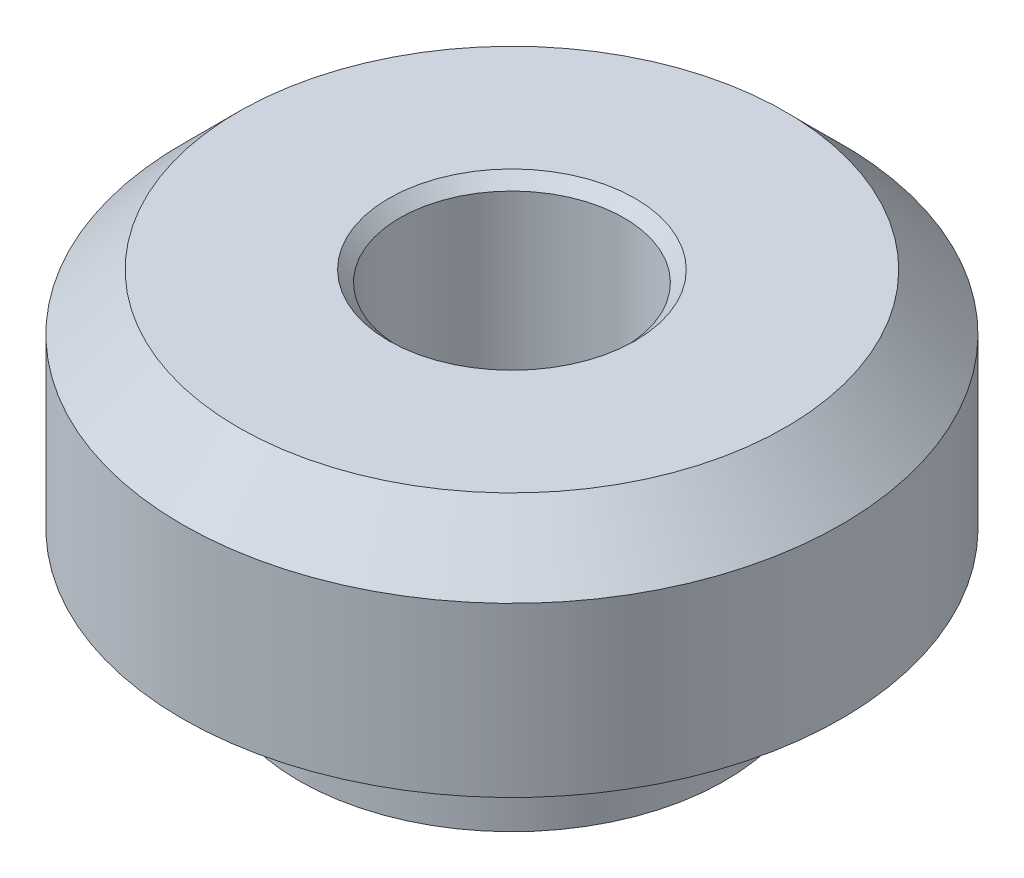
ISO-10303-21;
HEADER;
FILE_DESCRIPTION(('STEP AP214'),'2;1');
FILE_NAME('part.step','',(''),(''),'','','');
FILE_SCHEMA(('AUTOMOTIVE_DESIGN { 1 0 10303 214 1 1 1 1 }'));
ENDSEC;
DATA;
#1=APPLICATION_CONTEXT('core data for automotive mechanical design processes');
#2=APPLICATION_PROTOCOL_DEFINITION('international standard','automotive_design',2000,#1);
#3=PRODUCT_CONTEXT('',#1,'mechanical');
#4=PRODUCT('Part','Part','',(#3));
#5=PRODUCT_RELATED_PRODUCT_CATEGORY('part','',(#4));
#6=PRODUCT_DEFINITION_FORMATION('','',#4);
#7=PRODUCT_DEFINITION_CONTEXT('part definition',#1,'design');
#8=PRODUCT_DEFINITION('design','',#6,#7);
#9=PRODUCT_DEFINITION_SHAPE('','',#8);
#10=(LENGTH_UNIT() NAMED_UNIT(*) SI_UNIT(.MILLI.,.METRE.));
#11=(NAMED_UNIT(*) PLANE_ANGLE_UNIT() SI_UNIT($,.RADIAN.));
#12=(NAMED_UNIT(*) SI_UNIT($,.STERADIAN.) SOLID_ANGLE_UNIT());
#13=UNCERTAINTY_MEASURE_WITH_UNIT(LENGTH_MEASURE(1.E-05),#10,'distance_accuracy_value','');
#14=(GEOMETRIC_REPRESENTATION_CONTEXT(3) GLOBAL_UNCERTAINTY_ASSIGNED_CONTEXT((#13)) GLOBAL_UNIT_ASSIGNED_CONTEXT((#10,
#11,#12)) REPRESENTATION_CONTEXT('',''));
#15=CARTESIAN_POINT('',(0.,0.,0.));
#16=DIRECTION('',(0.,0.,1.));
#17=DIRECTION('',(1.,0.,0.));
#18=AXIS2_PLACEMENT_3D('',#15,#16,#17);
#19=CARTESIAN_POINT('',(0.,1.,0.));
#20=DIRECTION('',(0.,-1.,0.));
#21=DIRECTION('',(0.,0.,-1.));
#22=AXIS2_PLACEMENT_3D('',#19,#20,#21);
#23=CYLINDRICAL_SURFACE('',#22,1.9);
#24=CARTESIAN_POINT('',(0.,1.,0.));
#25=DIRECTION('',(0.,1.,0.));
#26=DIRECTION('',(0.,0.,1.));
#27=AXIS2_PLACEMENT_3D('',#24,#25,#26);
#28=CIRCLE('',#27,1.9);
#29=CARTESIAN_POINT('',(0.,1.,1.9));
#30=VERTEX_POINT('',#29);
#31=EDGE_CURVE('E66',#30,#30,#28,.T.);
#32=ORIENTED_EDGE('',*,*,#31,.F.);
#33=EDGE_LOOP('',(#32));
#34=FACE_BOUND('',#33,.T.);
#35=CARTESIAN_POINT('',(0.,0.,0.));
#36=DIRECTION('',(0.,1.,0.));
#37=DIRECTION('',(0.,0.,1.));
#38=AXIS2_PLACEMENT_3D('',#35,#36,#37);
#39=CIRCLE('',#38,1.9);
#40=CARTESIAN_POINT('',(0.,0.,1.9));
#41=VERTEX_POINT('',#40);
#42=EDGE_CURVE('E67',#41,#41,#39,.T.);
#43=ORIENTED_EDGE('',*,*,#42,.T.);
#44=EDGE_LOOP('',(#43));
#45=FACE_BOUND('',#44,.T.);
#46=ADVANCED_FACE('F45',(#34,#45),#23,.T.);
#47=CARTESIAN_POINT('',(0.,0.,0.));
#48=DIRECTION('',(0.,1.,0.));
#49=DIRECTION('',(0.,0.,1.));
#50=AXIS2_PLACEMENT_3D('',#47,#48,#49);
#51=PLANE('',#50);
#52=CARTESIAN_POINT('',(0.,0.,0.));
#53=DIRECTION('',(0.,1.,0.));
#54=DIRECTION('',(0.,0.,1.));
#55=AXIS2_PLACEMENT_3D('',#52,#53,#54);
#56=CIRCLE('',#55,1.);
#57=CARTESIAN_POINT('',(0.,0.,1.));
#58=VERTEX_POINT('',#57);
#59=EDGE_CURVE('E75',#58,#58,#56,.T.);
#60=ORIENTED_EDGE('',*,*,#59,.T.);
#61=EDGE_LOOP('',(#60));
#62=FACE_BOUND('',#61,.T.);
#63=ORIENTED_EDGE('',*,*,#42,.F.);
#64=EDGE_LOOP('',(#63));
#65=FACE_BOUND('',#64,.T.);
#66=ADVANCED_FACE('F79',(#62,#65),#51,.F.);
#67=CARTESIAN_POINT('',(0.,3.,0.));
#68=DIRECTION('',(0.,-1.,0.));
#69=DIRECTION('',(0.,0.,-1.));
#70=AXIS2_PLACEMENT_3D('',#67,#68,#69);
#71=CYLINDRICAL_SURFACE('',#70,2.94042027763422);
#72=CARTESIAN_POINT('',(0.,2.5,0.));
#73=DIRECTION('',(0.,1.,0.));
#74=DIRECTION('',(0.,0.,1.));
#75=AXIS2_PLACEMENT_3D('',#72,#73,#74);
#76=CIRCLE('',#75,2.94042027763422);
#77=CARTESIAN_POINT('',(0.,2.5,2.94042027763422));
#78=VERTEX_POINT('',#77);
#79=EDGE_CURVE('E57',#78,#78,#76,.F.);
#80=ORIENTED_EDGE('',*,*,#79,.T.);
#81=EDGE_LOOP('',(#80));
#82=FACE_BOUND('',#81,.T.);
#83=CARTESIAN_POINT('',(0.,1.,0.));
#84=DIRECTION('',(0.,1.,0.));
#85=DIRECTION('',(0.,0.,1.));
#86=AXIS2_PLACEMENT_3D('',#83,#84,#85);
#87=CIRCLE('',#86,2.94042027763422);
#88=CARTESIAN_POINT('',(0.,1.,2.94042027763422));
#89=VERTEX_POINT('',#88);
#90=EDGE_CURVE('E70',#89,#89,#87,.T.);
#91=ORIENTED_EDGE('',*,*,#90,.T.);
#92=EDGE_LOOP('',(#91));
#93=FACE_BOUND('',#92,.T.);
#94=ADVANCED_FACE('F99',(#82,#93),#71,.T.);
#95=CARTESIAN_POINT('',(0.,3.,0.));
#96=DIRECTION('',(0.,1.,0.));
#97=DIRECTION('',(0.,0.,1.));
#98=AXIS2_PLACEMENT_3D('',#95,#96,#97);
#99=PLANE('',#98);
#100=CARTESIAN_POINT('',(0.,3.,0.));
#101=DIRECTION('',(0.,1.,0.));
#102=DIRECTION('',(0.,0.,1.));
#103=AXIS2_PLACEMENT_3D('',#100,#101,#102);
#104=CIRCLE('',#103,1.1);
#105=CARTESIAN_POINT('',(0.,3.,1.1));
#106=VERTEX_POINT('',#105);
#107=EDGE_CURVE('E10',#106,#106,#104,.F.);
#108=ORIENTED_EDGE('',*,*,#107,.T.);
#109=EDGE_LOOP('',(#108));
#110=FACE_BOUND('',#109,.T.);
#111=CARTESIAN_POINT('',(0.,3.,0.));
#112=DIRECTION('',(0.,1.,0.));
#113=DIRECTION('',(0.,0.,1.));
#114=AXIS2_PLACEMENT_3D('',#111,#112,#113);
#115=CIRCLE('',#114,2.44042027763422);
#116=CARTESIAN_POINT('',(0.,3.,2.44042027763422));
#117=VERTEX_POINT('',#116);
#118=EDGE_CURVE('E61',#117,#117,#115,.T.);
#119=ORIENTED_EDGE('',*,*,#118,.T.);
#120=EDGE_LOOP('',(#119));
#121=FACE_BOUND('',#120,.T.);
#122=ADVANCED_FACE('F111',(#110,#121),#99,.T.);
#123=CARTESIAN_POINT('',(0.,1.,0.));
#124=DIRECTION('',(0.,1.,0.));
#125=DIRECTION('',(0.,0.,1.));
#126=AXIS2_PLACEMENT_3D('',#123,#124,#125);
#127=PLANE('',#126);
#128=ORIENTED_EDGE('',*,*,#31,.T.);
#129=EDGE_LOOP('',(#128));
#130=FACE_BOUND('',#129,.T.);
#131=ORIENTED_EDGE('',*,*,#90,.F.);
#132=EDGE_LOOP('',(#131));
#133=FACE_BOUND('',#132,.T.);
#134=ADVANCED_FACE('F90',(#130,#133),#127,.F.);
#135=CARTESIAN_POINT('',(0.,3.,0.));
#136=DIRECTION('',(0.,-1.,0.));
#137=DIRECTION('',(0.,0.,-1.));
#138=AXIS2_PLACEMENT_3D('',#135,#136,#137);
#139=CONICAL_SURFACE('',#138,2.44042027763422,0.785398163397445);
#140=ORIENTED_EDGE('',*,*,#79,.F.);
#141=EDGE_LOOP('',(#140));
#142=FACE_BOUND('',#141,.T.);
#143=ORIENTED_EDGE('',*,*,#118,.F.);
#144=EDGE_LOOP('',(#143));
#145=FACE_BOUND('',#144,.T.);
#146=ADVANCED_FACE('F84',(#142,#145),#139,.T.);
#147=CARTESIAN_POINT('',(0.,-1.,0.));
#148=DIRECTION('',(0.,1.,0.));
#149=DIRECTION('',(0.,0.,1.));
#150=AXIS2_PLACEMENT_3D('',#147,#148,#149);
#151=CYLINDRICAL_SURFACE('',#150,1.);
#152=CARTESIAN_POINT('',(0.,2.9,0.));
#153=DIRECTION('',(0.,1.,0.));
#154=DIRECTION('',(0.,0.,1.));
#155=AXIS2_PLACEMENT_3D('',#152,#153,#154);
#156=CIRCLE('',#155,1.);
#157=CARTESIAN_POINT('',(0.,2.9,1.));
#158=VERTEX_POINT('',#157);
#159=EDGE_CURVE('E53',#158,#158,#156,.T.);
#160=ORIENTED_EDGE('',*,*,#159,.T.);
#161=EDGE_LOOP('',(#160));
#162=FACE_BOUND('',#161,.T.);
#163=ORIENTED_EDGE('',*,*,#59,.F.);
#164=EDGE_LOOP('',(#163));
#165=FACE_BOUND('',#164,.T.);
#166=ADVANCED_FACE('F82',(#162,#165),#151,.F.);
#167=CARTESIAN_POINT('',(0.,2.9,0.));
#168=DIRECTION('',(0.,1.,0.));
#169=DIRECTION('',(0.,0.,1.));
#170=AXIS2_PLACEMENT_3D('',#167,#168,#169);
#171=CONICAL_SURFACE('',#170,1.,0.785398163397448);
#172=ORIENTED_EDGE('',*,*,#107,.F.);
#173=EDGE_LOOP('',(#172));
#174=FACE_BOUND('',#173,.T.);
#175=ORIENTED_EDGE('',*,*,#159,.F.);
#176=EDGE_LOOP('',(#175));
#177=FACE_BOUND('',#176,.T.);
#178=ADVANCED_FACE('F48',(#174,#177),#171,.F.);
#179=CLOSED_SHELL('',(#46,#66,#94,#122,#134,#146,#166,#178));
#180=MANIFOLD_SOLID_BREP('B2',#179);
#181=ADVANCED_BREP_SHAPE_REPRESENTATION('',(#18,#180),#14);
#182=SHAPE_DEFINITION_REPRESENTATION(#9,#181);
ENDSEC;
END-ISO-10303-21;
